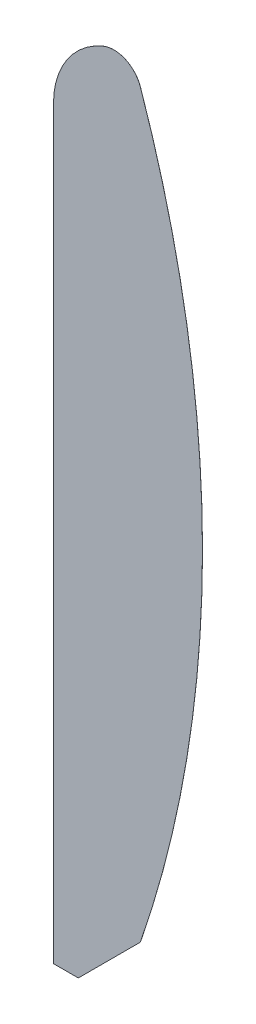
ISO-10303-21;
HEADER;
FILE_DESCRIPTION(('STEP AP214'),'2;1');
FILE_NAME('part.step','',(''),(''),'','','');
FILE_SCHEMA(('AUTOMOTIVE_DESIGN { 1 0 10303 214 1 1 1 1 }'));
ENDSEC;
DATA;
#1=APPLICATION_CONTEXT('core data for automotive mechanical design processes');
#2=APPLICATION_PROTOCOL_DEFINITION('international standard','automotive_design',2000,#1);
#3=PRODUCT_CONTEXT('',#1,'mechanical');
#4=PRODUCT('Part','Part','',(#3));
#5=PRODUCT_RELATED_PRODUCT_CATEGORY('part','',(#4));
#6=PRODUCT_DEFINITION_FORMATION('','',#4);
#7=PRODUCT_DEFINITION_CONTEXT('part definition',#1,'design');
#8=PRODUCT_DEFINITION('design','',#6,#7);
#9=PRODUCT_DEFINITION_SHAPE('','',#8);
#10=(LENGTH_UNIT() NAMED_UNIT(*) SI_UNIT(.MILLI.,.METRE.));
#11=(NAMED_UNIT(*) PLANE_ANGLE_UNIT() SI_UNIT($,.RADIAN.));
#12=(NAMED_UNIT(*) SI_UNIT($,.STERADIAN.) SOLID_ANGLE_UNIT());
#13=UNCERTAINTY_MEASURE_WITH_UNIT(LENGTH_MEASURE(1.E-05),#10,'distance_accuracy_value','');
#14=(GEOMETRIC_REPRESENTATION_CONTEXT(3) GLOBAL_UNCERTAINTY_ASSIGNED_CONTEXT((#13)) GLOBAL_UNIT_ASSIGNED_CONTEXT((#10,
#11,#12)) REPRESENTATION_CONTEXT('',''));
#15=CARTESIAN_POINT('',(0.,0.,0.));
#16=DIRECTION('',(0.,0.,1.));
#17=DIRECTION('',(1.,0.,0.));
#18=AXIS2_PLACEMENT_3D('',#15,#16,#17);
#19=CARTESIAN_POINT('',(0.,0.,0.01));
#20=DIRECTION('',(0.,1.,0.));
#21=DIRECTION('',(-1.,0.,0.));
#22=AXIS2_PLACEMENT_3D('',#19,#20,#21);
#23=PLANE('',#22);
#24=DIRECTION('',(1.,0.,0.));
#25=VECTOR('',#24,1.);
#26=CARTESIAN_POINT('',(0.,0.,0.));
#27=LINE('',#26,#25);
#28=CARTESIAN_POINT('',(0.,0.,0.));
#29=VERTEX_POINT('',#28);
#30=CARTESIAN_POINT('',(5.,0.,0.));
#31=VERTEX_POINT('',#30);
#32=EDGE_CURVE('E130',#29,#31,#27,.T.);
#33=ORIENTED_EDGE('',*,*,#32,.T.);
#34=DIRECTION('',(0.,0.,-1.));
#35=VECTOR('',#34,1.);
#36=CARTESIAN_POINT('',(5.,0.,0.01));
#37=LINE('',#36,#35);
#38=CARTESIAN_POINT('',(5.,0.,0.01));
#39=VERTEX_POINT('',#38);
#40=EDGE_CURVE('E11',#39,#31,#37,.T.);
#41=ORIENTED_EDGE('',*,*,#40,.F.);
#42=DIRECTION('',(1.,0.,0.));
#43=VECTOR('',#42,1.);
#44=CARTESIAN_POINT('',(0.,0.,0.01));
#45=LINE('',#44,#43);
#46=CARTESIAN_POINT('',(0.,0.,0.01));
#47=VERTEX_POINT('',#46);
#48=EDGE_CURVE('E139',#47,#39,#45,.T.);
#49=ORIENTED_EDGE('',*,*,#48,.F.);
#50=DIRECTION('',(0.,0.,-1.));
#51=VECTOR('',#50,1.);
#52=CARTESIAN_POINT('',(0.,0.,0.01));
#53=LINE('',#52,#51);
#54=EDGE_CURVE('E56',#47,#29,#53,.T.);
#55=ORIENTED_EDGE('',*,*,#54,.T.);
#56=EDGE_LOOP('',(#33,#41,#49,#55));
#57=FACE_BOUND('',#56,.T.);
#58=ADVANCED_FACE('F43',(#57),#23,.F.);
#59=CARTESIAN_POINT('',(5.,0.,0.01));
#60=DIRECTION('',(-0.707106781186547,0.707106781186547,0.));
#61=DIRECTION('',(-0.707106781186548,-0.707106781186548,0.));
#62=AXIS2_PLACEMENT_3D('',#59,#60,#61);
#63=PLANE('',#62);
#64=DIRECTION('',(0.707106781186547,0.707106781186547,0.));
#65=VECTOR('',#64,1.);
#66=CARTESIAN_POINT('',(5.,0.,0.));
#67=LINE('',#66,#65);
#68=CARTESIAN_POINT('',(17.4999999999999,12.4999999999999,0.));
#69=VERTEX_POINT('',#68);
#70=EDGE_CURVE('E129',#31,#69,#67,.T.);
#71=ORIENTED_EDGE('',*,*,#70,.T.);
#72=DIRECTION('',(0.,0.,-1.));
#73=VECTOR('',#72,1.);
#74=CARTESIAN_POINT('',(17.4999999999999,12.4999999999999,0.01));
#75=LINE('',#74,#73);
#76=CARTESIAN_POINT('',(17.4999999999999,12.4999999999999,0.01));
#77=VERTEX_POINT('',#76);
#78=EDGE_CURVE('E51',#77,#69,#75,.T.);
#79=ORIENTED_EDGE('',*,*,#78,.F.);
#80=DIRECTION('',(0.707106781186547,0.707106781186547,0.));
#81=VECTOR('',#80,1.);
#82=CARTESIAN_POINT('',(5.,0.,0.01));
#83=LINE('',#82,#81);
#84=EDGE_CURVE('E91',#39,#77,#83,.T.);
#85=ORIENTED_EDGE('',*,*,#84,.F.);
#86=ORIENTED_EDGE('',*,*,#40,.T.);
#87=EDGE_LOOP('',(#71,#79,#85,#86));
#88=FACE_BOUND('',#87,.T.);
#89=ADVANCED_FACE('F158',(#88),#63,.F.);
#90=CARTESIAN_POINT('',(-198.657986152389,87.066746300276,0.01));
#91=DIRECTION('',(0.,0.,-1.));
#92=DIRECTION('',(-1.,0.,0.));
#93=AXIS2_PLACEMENT_3D('',#90,#91,#92);
#94=CYLINDRICAL_SURFACE('',#93,228.657986152389);
#95=CARTESIAN_POINT('',(-198.657986152389,87.066746300276,0.));
#96=DIRECTION('',(0.,0.,1.));
#97=DIRECTION('',(1.,0.,0.));
#98=AXIS2_PLACEMENT_3D('',#95,#96,#97);
#99=CIRCLE('',#98,228.657986152389);
#100=CARTESIAN_POINT('',(17.5,161.633492600552,0.));
#101=VERTEX_POINT('',#100);
#102=EDGE_CURVE('E131',#69,#101,#99,.T.);
#103=ORIENTED_EDGE('',*,*,#102,.T.);
#104=DIRECTION('',(0.,0.,-1.));
#105=VECTOR('',#104,1.);
#106=CARTESIAN_POINT('',(17.5,161.633492600552,0.01));
#107=LINE('',#106,#105);
#108=CARTESIAN_POINT('',(17.5,161.633492600552,0.01));
#109=VERTEX_POINT('',#108);
#110=EDGE_CURVE('E109',#109,#101,#107,.T.);
#111=ORIENTED_EDGE('',*,*,#110,.F.);
#112=CARTESIAN_POINT('',(-198.657986152389,87.066746300276,0.01));
#113=DIRECTION('',(0.,0.,1.));
#114=DIRECTION('',(1.,0.,0.));
#115=AXIS2_PLACEMENT_3D('',#112,#113,#114);
#116=CIRCLE('',#115,228.657986152389);
#117=EDGE_CURVE('E120',#77,#109,#116,.T.);
#118=ORIENTED_EDGE('',*,*,#117,.F.);
#119=ORIENTED_EDGE('',*,*,#78,.T.);
#120=EDGE_LOOP('',(#103,#111,#118,#119));
#121=FACE_BOUND('',#120,.T.);
#122=ADVANCED_FACE('F147',(#121),#94,.T.);
#123=CARTESIAN_POINT('',(12.168967593345,159.794477775972,0.01));
#124=DIRECTION('',(0.,0.,-1.));
#125=DIRECTION('',(-1.,0.,0.));
#126=AXIS2_PLACEMENT_3D('',#123,#124,#125);
#127=CYLINDRICAL_SURFACE('',#126,5.63931574269702);
#128=CARTESIAN_POINT('',(12.168967593345,159.794477775972,0.));
#129=DIRECTION('',(0.,0.,-1.));
#130=DIRECTION('',(-1.,0.,0.));
#131=AXIS2_PLACEMENT_3D('',#128,#129,#130);
#132=CIRCLE('',#131,5.63931574269702);
#133=CARTESIAN_POINT('',(10.,165.,0.));
#134=VERTEX_POINT('',#133);
#135=EDGE_CURVE('E108',#134,#101,#132,.T.);
#136=ORIENTED_EDGE('',*,*,#135,.F.);
#137=DIRECTION('',(0.,0.,-1.));
#138=VECTOR('',#137,1.);
#139=CARTESIAN_POINT('',(10.,165.,0.01));
#140=LINE('',#139,#138);
#141=CARTESIAN_POINT('',(10.,165.,0.01));
#142=VERTEX_POINT('',#141);
#143=EDGE_CURVE('E102',#142,#134,#140,.T.);
#144=ORIENTED_EDGE('',*,*,#143,.F.);
#145=CARTESIAN_POINT('',(12.168967593345,159.794477775972,0.01));
#146=DIRECTION('',(0.,0.,-1.));
#147=DIRECTION('',(-1.,0.,0.));
#148=AXIS2_PLACEMENT_3D('',#145,#146,#147);
#149=CIRCLE('',#148,5.63931574269702);
#150=EDGE_CURVE('E101',#142,#109,#149,.T.);
#151=ORIENTED_EDGE('',*,*,#150,.T.);
#152=ORIENTED_EDGE('',*,*,#110,.T.);
#153=EDGE_LOOP('',(#136,#144,#151,#152));
#154=FACE_BOUND('',#153,.T.);
#155=ADVANCED_FACE('F104',(#154),#127,.T.);
#156=CARTESIAN_POINT('',(16.25,150.,0.01));
#157=DIRECTION('',(0.,0.,-1.));
#158=DIRECTION('',(-1.,0.,0.));
#159=AXIS2_PLACEMENT_3D('',#156,#157,#158);
#160=CYLINDRICAL_SURFACE('',#159,16.25);
#161=CARTESIAN_POINT('',(16.25,150.,0.));
#162=DIRECTION('',(0.,0.,-1.));
#163=DIRECTION('',(-1.,0.,0.));
#164=AXIS2_PLACEMENT_3D('',#161,#162,#163);
#165=CIRCLE('',#164,16.25);
#166=CARTESIAN_POINT('',(0.,150.,0.));
#167=VERTEX_POINT('',#166);
#168=EDGE_CURVE('E134',#167,#134,#165,.T.);
#169=ORIENTED_EDGE('',*,*,#168,.F.);
#170=DIRECTION('',(0.,0.,-1.));
#171=VECTOR('',#170,1.);
#172=CARTESIAN_POINT('',(0.,150.,0.01));
#173=LINE('',#172,#171);
#174=CARTESIAN_POINT('',(0.,150.,0.01));
#175=VERTEX_POINT('',#174);
#176=EDGE_CURVE('E80',#175,#167,#173,.T.);
#177=ORIENTED_EDGE('',*,*,#176,.F.);
#178=CARTESIAN_POINT('',(16.25,150.,0.01));
#179=DIRECTION('',(0.,0.,-1.));
#180=DIRECTION('',(-1.,0.,0.));
#181=AXIS2_PLACEMENT_3D('',#178,#179,#180);
#182=CIRCLE('',#181,16.25);
#183=EDGE_CURVE('E117',#175,#142,#182,.T.);
#184=ORIENTED_EDGE('',*,*,#183,.T.);
#185=ORIENTED_EDGE('',*,*,#143,.T.);
#186=EDGE_LOOP('',(#169,#177,#184,#185));
#187=FACE_BOUND('',#186,.T.);
#188=ADVANCED_FACE('F123',(#187),#160,.T.);
#189=CARTESIAN_POINT('',(0.,0.,0.01));
#190=DIRECTION('',(-1.,0.,0.));
#191=DIRECTION('',(0.,-1.,0.));
#192=AXIS2_PLACEMENT_3D('',#189,#190,#191);
#193=PLANE('',#192);
#194=DIRECTION('',(0.,1.,0.));
#195=VECTOR('',#194,1.);
#196=CARTESIAN_POINT('',(0.,0.,0.));
#197=LINE('',#196,#195);
#198=EDGE_CURVE('E140',#29,#167,#197,.T.);
#199=ORIENTED_EDGE('',*,*,#198,.F.);
#200=ORIENTED_EDGE('',*,*,#54,.F.);
#201=DIRECTION('',(0.,1.,0.));
#202=VECTOR('',#201,1.);
#203=CARTESIAN_POINT('',(0.,0.,0.01));
#204=LINE('',#203,#202);
#205=EDGE_CURVE('E122',#47,#175,#204,.T.);
#206=ORIENTED_EDGE('',*,*,#205,.T.);
#207=ORIENTED_EDGE('',*,*,#176,.T.);
#208=EDGE_LOOP('',(#199,#200,#206,#207));
#209=FACE_BOUND('',#208,.T.);
#210=ADVANCED_FACE('F146',(#209),#193,.T.);
#211=CARTESIAN_POINT('',(-198.657986152389,87.066746300276,0.01));
#212=DIRECTION('',(0.,0.,1.));
#213=DIRECTION('',(1.,0.,0.));
#214=AXIS2_PLACEMENT_3D('',#211,#212,#213);
#215=PLANE('',#214);
#216=ORIENTED_EDGE('',*,*,#48,.T.);
#217=ORIENTED_EDGE('',*,*,#84,.T.);
#218=ORIENTED_EDGE('',*,*,#117,.T.);
#219=ORIENTED_EDGE('',*,*,#150,.F.);
#220=ORIENTED_EDGE('',*,*,#183,.F.);
#221=ORIENTED_EDGE('',*,*,#205,.F.);
#222=EDGE_LOOP('',(#216,#217,#218,#219,#220,#221));
#223=FACE_BOUND('',#222,.T.);
#224=ADVANCED_FACE('F114',(#223),#215,.T.);
#225=CARTESIAN_POINT('',(-198.657986152389,87.066746300276,0.));
#226=DIRECTION('',(0.,0.,1.));
#227=DIRECTION('',(1.,0.,0.));
#228=AXIS2_PLACEMENT_3D('',#225,#226,#227);
#229=PLANE('',#228);
#230=ORIENTED_EDGE('',*,*,#32,.F.);
#231=ORIENTED_EDGE('',*,*,#198,.T.);
#232=ORIENTED_EDGE('',*,*,#168,.T.);
#233=ORIENTED_EDGE('',*,*,#135,.T.);
#234=ORIENTED_EDGE('',*,*,#102,.F.);
#235=ORIENTED_EDGE('',*,*,#70,.F.);
#236=EDGE_LOOP('',(#230,#231,#232,#233,#234,#235));
#237=FACE_BOUND('',#236,.T.);
#238=ADVANCED_FACE('F149',(#237),#229,.F.);
#239=CLOSED_SHELL('',(#58,#89,#122,#155,#188,#210,#224,#238));
#240=MANIFOLD_SOLID_BREP('B2',#239);
#241=ADVANCED_BREP_SHAPE_REPRESENTATION('',(#18,#240),#14);
#242=SHAPE_DEFINITION_REPRESENTATION(#9,#241);
ENDSEC;
END-ISO-10303-21;
